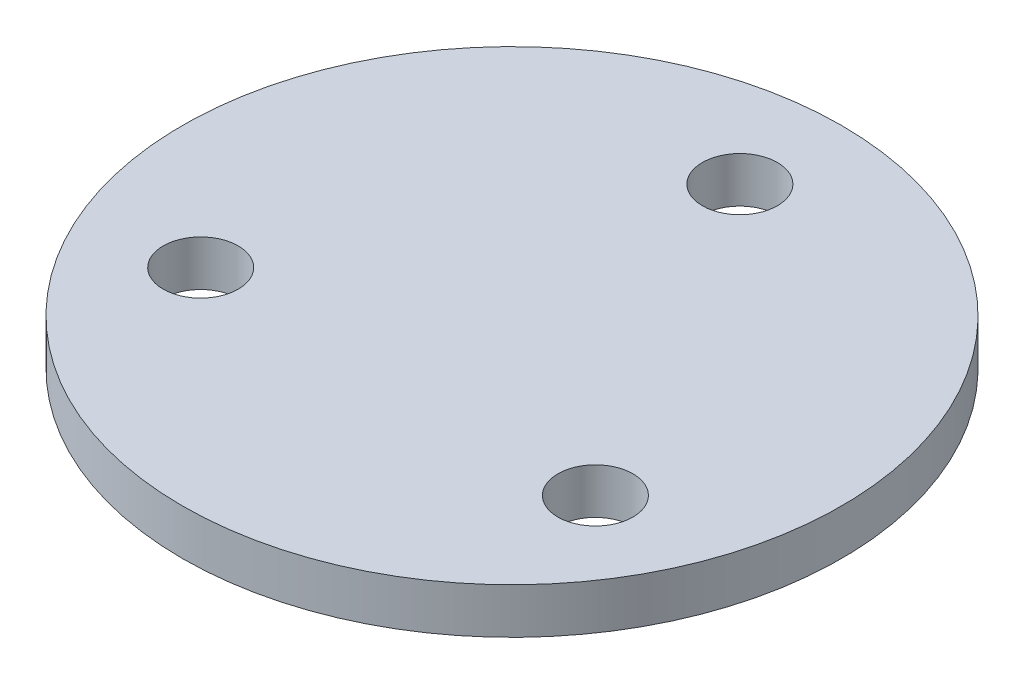
ISO-10303-21;
HEADER;
FILE_DESCRIPTION(('STEP AP214'),'2;1');
FILE_NAME('part.step','',(''),(''),'','','');
FILE_SCHEMA(('AUTOMOTIVE_DESIGN { 1 0 10303 214 1 1 1 1 }'));
ENDSEC;
DATA;
#1=APPLICATION_CONTEXT('core data for automotive mechanical design processes');
#2=APPLICATION_PROTOCOL_DEFINITION('international standard','automotive_design',2000,#1);
#3=PRODUCT_CONTEXT('',#1,'mechanical');
#4=PRODUCT('Part','Part','',(#3));
#5=PRODUCT_RELATED_PRODUCT_CATEGORY('part','',(#4));
#6=PRODUCT_DEFINITION_FORMATION('','',#4);
#7=PRODUCT_DEFINITION_CONTEXT('part definition',#1,'design');
#8=PRODUCT_DEFINITION('design','',#6,#7);
#9=PRODUCT_DEFINITION_SHAPE('','',#8);
#10=(LENGTH_UNIT() NAMED_UNIT(*) SI_UNIT(.MILLI.,.METRE.));
#11=(NAMED_UNIT(*) PLANE_ANGLE_UNIT() SI_UNIT($,.RADIAN.));
#12=(NAMED_UNIT(*) SI_UNIT($,.STERADIAN.) SOLID_ANGLE_UNIT());
#13=UNCERTAINTY_MEASURE_WITH_UNIT(LENGTH_MEASURE(1.E-05),#10,'distance_accuracy_value','');
#14=(GEOMETRIC_REPRESENTATION_CONTEXT(3) GLOBAL_UNCERTAINTY_ASSIGNED_CONTEXT((#13)) GLOBAL_UNIT_ASSIGNED_CONTEXT((#10,
#11,#12)) REPRESENTATION_CONTEXT('',''));
#15=CARTESIAN_POINT('',(0.,0.,0.));
#16=DIRECTION('',(0.,0.,1.));
#17=DIRECTION('',(1.,0.,0.));
#18=AXIS2_PLACEMENT_3D('',#15,#16,#17);
#19=CARTESIAN_POINT('',(0.,1.651,0.));
#20=DIRECTION('',(0.,-1.,0.));
#21=DIRECTION('',(0.,0.,-1.));
#22=AXIS2_PLACEMENT_3D('',#19,#20,#21);
#23=CYLINDRICAL_SURFACE('',#22,11.938);
#24=CARTESIAN_POINT('',(0.,1.651,0.));
#25=DIRECTION('',(0.,1.,0.));
#26=DIRECTION('',(0.,0.,1.));
#27=AXIS2_PLACEMENT_3D('',#24,#25,#26);
#28=CIRCLE('',#27,11.938);
#29=CARTESIAN_POINT('',(0.,1.651,-11.938));
#30=VERTEX_POINT('',#29);
#31=EDGE_CURVE('E10',#30,#30,#28,.T.);
#32=CARTESIAN_POINT('',(0.,0.,0.));
#33=DIRECTION('',(0.,1.,0.));
#34=DIRECTION('',(0.,0.,1.));
#35=AXIS2_PLACEMENT_3D('',#32,#33,#34);
#36=CIRCLE('',#35,11.938);
#37=CARTESIAN_POINT('',(0.,0.,-11.938));
#38=VERTEX_POINT('',#37);
#39=EDGE_CURVE('E36',#38,#38,#36,.T.);
#40=CARTESIAN_POINT('',(0.,1.651,-11.938));
#41=CARTESIAN_POINT('',(0.,1.63380208333333,-11.938));
#42=CARTESIAN_POINT('',(0.,1.61660416666667,-11.938));
#43=CARTESIAN_POINT('',(0.,1.58220833333333,-11.938));
#44=CARTESIAN_POINT('',(0.,1.56501041666667,-11.938));
#45=CARTESIAN_POINT('',(0.,1.53061458333333,-11.938));
#46=CARTESIAN_POINT('',(0.,1.51341666666667,-11.938));
#47=CARTESIAN_POINT('',(0.,1.47902083333333,-11.938));
#48=CARTESIAN_POINT('',(0.,1.46182291666667,-11.938));
#49=CARTESIAN_POINT('',(0.,1.42742708333333,-11.938));
#50=CARTESIAN_POINT('',(0.,1.41022916666667,-11.938));
#51=CARTESIAN_POINT('',(0.,1.37583333333333,-11.938));
#52=CARTESIAN_POINT('',(0.,1.35863541666667,-11.938));
#53=CARTESIAN_POINT('',(0.,1.32423958333333,-11.938));
#54=CARTESIAN_POINT('',(0.,1.30704166666667,-11.938));
#55=CARTESIAN_POINT('',(0.,1.27264583333333,-11.938));
#56=CARTESIAN_POINT('',(0.,1.25544791666667,-11.938));
#57=CARTESIAN_POINT('',(0.,1.22105208333333,-11.938));
#58=CARTESIAN_POINT('',(0.,1.20385416666667,-11.938));
#59=CARTESIAN_POINT('',(0.,1.16945833333333,-11.938));
#60=CARTESIAN_POINT('',(0.,1.15226041666667,-11.938));
#61=CARTESIAN_POINT('',(0.,1.11786458333333,-11.938));
#62=CARTESIAN_POINT('',(0.,1.10066666666667,-11.938));
#63=CARTESIAN_POINT('',(0.,1.06627083333333,-11.938));
#64=CARTESIAN_POINT('',(0.,1.04907291666667,-11.938));
#65=CARTESIAN_POINT('',(0.,1.01467708333333,-11.938));
#66=CARTESIAN_POINT('',(0.,0.997479166666666,-11.938));
#67=CARTESIAN_POINT('',(0.,0.963083333333333,-11.938));
#68=CARTESIAN_POINT('',(0.,0.945885416666666,-11.938));
#69=CARTESIAN_POINT('',(0.,0.911489583333333,-11.938));
#70=CARTESIAN_POINT('',(0.,0.894291666666666,-11.938));
#71=CARTESIAN_POINT('',(0.,0.859895833333333,-11.938));
#72=CARTESIAN_POINT('',(0.,0.842697916666666,-11.938));
#73=CARTESIAN_POINT('',(0.,0.808302083333333,-11.938));
#74=CARTESIAN_POINT('',(0.,0.791104166666666,-11.938));
#75=CARTESIAN_POINT('',(0.,0.756708333333333,-11.938));
#76=CARTESIAN_POINT('',(0.,0.739510416666667,-11.938));
#77=CARTESIAN_POINT('',(0.,0.705114583333333,-11.938));
#78=CARTESIAN_POINT('',(0.,0.687916666666667,-11.938));
#79=CARTESIAN_POINT('',(0.,0.653520833333333,-11.938));
#80=CARTESIAN_POINT('',(0.,0.636322916666667,-11.938));
#81=CARTESIAN_POINT('',(0.,0.601927083333333,-11.938));
#82=CARTESIAN_POINT('',(0.,0.584729166666667,-11.938));
#83=CARTESIAN_POINT('',(0.,0.550333333333333,-11.938));
#84=CARTESIAN_POINT('',(0.,0.533135416666667,-11.938));
#85=CARTESIAN_POINT('',(0.,0.498739583333333,-11.938));
#86=CARTESIAN_POINT('',(0.,0.481541666666667,-11.938));
#87=CARTESIAN_POINT('',(0.,0.447145833333333,-11.938));
#88=CARTESIAN_POINT('',(0.,0.429947916666667,-11.938));
#89=CARTESIAN_POINT('',(0.,0.395552083333333,-11.938));
#90=CARTESIAN_POINT('',(0.,0.378354166666667,-11.938));
#91=CARTESIAN_POINT('',(0.,0.343958333333333,-11.938));
#92=CARTESIAN_POINT('',(0.,0.326760416666667,-11.938));
#93=CARTESIAN_POINT('',(0.,0.292364583333333,-11.938));
#94=CARTESIAN_POINT('',(0.,0.275166666666667,-11.938));
#95=CARTESIAN_POINT('',(0.,0.240770833333333,-11.938));
#96=CARTESIAN_POINT('',(0.,0.223572916666667,-11.938));
#97=CARTESIAN_POINT('',(0.,0.189177083333333,-11.938));
#98=CARTESIAN_POINT('',(0.,0.171979166666667,-11.938));
#99=CARTESIAN_POINT('',(0.,0.137583333333333,-11.938));
#100=CARTESIAN_POINT('',(0.,0.120385416666667,-11.938));
#101=CARTESIAN_POINT('',(0.,0.0859895833333333,-11.938));
#102=CARTESIAN_POINT('',(0.,0.0687916666666667,-11.938));
#103=CARTESIAN_POINT('',(0.,0.0343958333333333,-11.938));
#104=CARTESIAN_POINT('',(0.,0.0171979166666666,-11.938));
#105=CARTESIAN_POINT('',(0.,0.,-11.938));
#106=B_SPLINE_CURVE_WITH_KNOTS('',3,(#40,#41,#42,#43,#44,#45,#46,#47,#48,#49,#50,#51,#52,#53,
#54,#55,#56,#57,#58,#59,#60,#61,#62,#63,#64,#65,#66,#67,#68,#69,#70,#71,#72,#73,#74,#75,#76,#77,
#78,#79,#80,#81,#82,#83,#84,#85,#86,#87,#88,#89,#90,#91,#92,#93,#94,#95,#96,#97,#98,#99,#100,
#101,#102,#103,#104,#105),.UNSPECIFIED.,.F.,.F.,(4,2,2,2,2,2,2,2,2,2,2,2,2,2,2,2,2,2,2,2,2,2,2,
2,2,2,2,2,2,2,2,2,4),(0.,0.0515937500000002,0.1031875,0.15478125,0.206375,0.25796875,0.3095625,
0.36115625,0.41275,0.46434375,0.5159375,0.56753125,0.619125,0.67071875,0.7223125,0.77390625,
0.8255,0.87709375,0.9286875,0.98028125,1.031875,1.08346875,1.1350625,1.18665625,1.23825,
1.28984375,1.3414375,1.39303125,1.444625,1.49621875,1.5478125,1.59940625,1.651),.UNSPECIFIED.);
#107=EDGE_CURVE('BSEAM33',#30,#38,#106,.T.);
#108=ORIENTED_EDGE('',*,*,#31,.F.);
#109=ORIENTED_EDGE('',*,*,#39,.T.);
#110=ORIENTED_EDGE('',*,*,#107,.T.);
#111=ORIENTED_EDGE('',*,*,#107,.F.);
#112=EDGE_LOOP('',(#108,#110,#109,#111));
#113=FACE_BOUND('',#112,.T.);
#114=ADVANCED_FACE('F33',(#113),#23,.T.);
#115=CARTESIAN_POINT('',(0.,1.651,0.));
#116=DIRECTION('',(0.,1.,0.));
#117=DIRECTION('',(0.,0.,1.));
#118=AXIS2_PLACEMENT_3D('',#115,#116,#117);
#119=PLANE('',#118);
#120=CARTESIAN_POINT('',(7.14903970824058,1.651,4.12749999999993));
#121=DIRECTION('',(0.,1.,0.));
#122=DIRECTION('',(-0.866025403784443,0.,-0.499999999999992));
#123=AXIS2_PLACEMENT_3D('',#120,#121,#122);
#124=CIRCLE('',#123,1.3589);
#125=CARTESIAN_POINT('',(7.14903970824058,1.651,5.48639999999993));
#126=VERTEX_POINT('',#125);
#127=EDGE_CURVE('E57',#126,#126,#124,.T.);
#128=ORIENTED_EDGE('',*,*,#127,.F.);
#129=EDGE_LOOP('',(#128));
#130=FACE_BOUND('',#129,.T.);
#131=CARTESIAN_POINT('',(-7.14903970824052,1.651,4.12750000000003));
#132=DIRECTION('',(0.,1.,0.));
#133=DIRECTION('',(0.866025403784436,0.,-0.500000000000004));
#134=AXIS2_PLACEMENT_3D('',#131,#132,#133);
#135=CIRCLE('',#134,1.3589);
#136=CARTESIAN_POINT('',(-7.14903970824052,1.651,5.48640000000003));
#137=VERTEX_POINT('',#136);
#138=EDGE_CURVE('E51',#137,#137,#135,.T.);
#139=ORIENTED_EDGE('',*,*,#138,.F.);
#140=EDGE_LOOP('',(#139));
#141=FACE_BOUND('',#140,.T.);
#142=CARTESIAN_POINT('',(0.,1.651,-8.255));
#143=DIRECTION('',(0.,1.,0.));
#144=DIRECTION('',(0.,0.,1.));
#145=AXIS2_PLACEMENT_3D('',#142,#143,#144);
#146=CIRCLE('',#145,1.3589);
#147=CARTESIAN_POINT('',(0.,1.651,-6.8961));
#148=VERTEX_POINT('',#147);
#149=EDGE_CURVE('E45',#148,#148,#146,.T.);
#150=ORIENTED_EDGE('',*,*,#149,.F.);
#151=EDGE_LOOP('',(#150));
#152=FACE_BOUND('',#151,.T.);
#153=ORIENTED_EDGE('',*,*,#31,.T.);
#154=EDGE_LOOP('',(#153));
#155=FACE_BOUND('',#154,.T.);
#156=ADVANCED_FACE('F73',(#130,#141,#152,#155),#119,.T.);
#157=CARTESIAN_POINT('',(0.,0.,0.));
#158=DIRECTION('',(0.,1.,0.));
#159=DIRECTION('',(0.,0.,1.));
#160=AXIS2_PLACEMENT_3D('',#157,#158,#159);
#161=PLANE('',#160);
#162=CARTESIAN_POINT('',(7.14903970824058,0.,4.12749999999993));
#163=DIRECTION('',(0.,1.,0.));
#164=DIRECTION('',(-0.866025403784443,0.,-0.499999999999992));
#165=AXIS2_PLACEMENT_3D('',#162,#163,#164);
#166=CIRCLE('',#165,1.3589);
#167=CARTESIAN_POINT('',(7.14903970824058,0.,5.48639999999993));
#168=VERTEX_POINT('',#167);
#169=EDGE_CURVE('E54',#168,#168,#166,.T.);
#170=ORIENTED_EDGE('',*,*,#169,.T.);
#171=EDGE_LOOP('',(#170));
#172=FACE_BOUND('',#171,.T.);
#173=CARTESIAN_POINT('',(-7.14903970824052,0.,4.12750000000003));
#174=DIRECTION('',(0.,1.,0.));
#175=DIRECTION('',(0.866025403784436,0.,-0.500000000000004));
#176=AXIS2_PLACEMENT_3D('',#173,#174,#175);
#177=CIRCLE('',#176,1.3589);
#178=CARTESIAN_POINT('',(-7.14903970824052,0.,5.48640000000003));
#179=VERTEX_POINT('',#178);
#180=EDGE_CURVE('E48',#179,#179,#177,.T.);
#181=ORIENTED_EDGE('',*,*,#180,.T.);
#182=EDGE_LOOP('',(#181));
#183=FACE_BOUND('',#182,.T.);
#184=CARTESIAN_POINT('',(0.,0.,-8.255));
#185=DIRECTION('',(0.,1.,0.));
#186=DIRECTION('',(0.,0.,1.));
#187=AXIS2_PLACEMENT_3D('',#184,#185,#186);
#188=CIRCLE('',#187,1.3589);
#189=CARTESIAN_POINT('',(0.,0.,-6.8961));
#190=VERTEX_POINT('',#189);
#191=EDGE_CURVE('E43',#190,#190,#188,.T.);
#192=ORIENTED_EDGE('',*,*,#191,.T.);
#193=EDGE_LOOP('',(#192));
#194=FACE_BOUND('',#193,.T.);
#195=ORIENTED_EDGE('',*,*,#39,.F.);
#196=EDGE_LOOP('',(#195));
#197=FACE_BOUND('',#196,.T.);
#198=ADVANCED_FACE('F63',(#172,#183,#194,#197),#161,.F.);
#199=CARTESIAN_POINT('',(0.,0.,-8.255));
#200=DIRECTION('',(0.,1.,0.));
#201=DIRECTION('',(0.,0.,1.));
#202=AXIS2_PLACEMENT_3D('',#199,#200,#201);
#203=CYLINDRICAL_SURFACE('',#202,1.3589);
#204=CARTESIAN_POINT('',(0.,0.,-6.8961));
#205=CARTESIAN_POINT('',(0.,0.0171979166666667,-6.8961));
#206=CARTESIAN_POINT('',(0.,0.0343958333333333,-6.8961));
#207=CARTESIAN_POINT('',(0.,0.0687916666666667,-6.8961));
#208=CARTESIAN_POINT('',(0.,0.0859895833333333,-6.8961));
#209=CARTESIAN_POINT('',(0.,0.120385416666667,-6.8961));
#210=CARTESIAN_POINT('',(0.,0.137583333333333,-6.8961));
#211=CARTESIAN_POINT('',(0.,0.171979166666667,-6.8961));
#212=CARTESIAN_POINT('',(0.,0.189177083333333,-6.8961));
#213=CARTESIAN_POINT('',(0.,0.223572916666667,-6.8961));
#214=CARTESIAN_POINT('',(0.,0.240770833333333,-6.8961));
#215=CARTESIAN_POINT('',(0.,0.275166666666667,-6.8961));
#216=CARTESIAN_POINT('',(0.,0.292364583333333,-6.8961));
#217=CARTESIAN_POINT('',(0.,0.326760416666667,-6.8961));
#218=CARTESIAN_POINT('',(0.,0.343958333333333,-6.8961));
#219=CARTESIAN_POINT('',(0.,0.378354166666667,-6.8961));
#220=CARTESIAN_POINT('',(0.,0.395552083333333,-6.8961));
#221=CARTESIAN_POINT('',(0.,0.429947916666667,-6.8961));
#222=CARTESIAN_POINT('',(0.,0.447145833333333,-6.8961));
#223=CARTESIAN_POINT('',(0.,0.481541666666667,-6.8961));
#224=CARTESIAN_POINT('',(0.,0.498739583333333,-6.8961));
#225=CARTESIAN_POINT('',(0.,0.533135416666667,-6.8961));
#226=CARTESIAN_POINT('',(0.,0.550333333333333,-6.8961));
#227=CARTESIAN_POINT('',(0.,0.584729166666667,-6.8961));
#228=CARTESIAN_POINT('',(0.,0.601927083333333,-6.8961));
#229=CARTESIAN_POINT('',(0.,0.636322916666667,-6.8961));
#230=CARTESIAN_POINT('',(0.,0.653520833333333,-6.8961));
#231=CARTESIAN_POINT('',(0.,0.687916666666667,-6.8961));
#232=CARTESIAN_POINT('',(0.,0.705114583333333,-6.8961));
#233=CARTESIAN_POINT('',(0.,0.739510416666667,-6.8961));
#234=CARTESIAN_POINT('',(0.,0.756708333333333,-6.8961));
#235=CARTESIAN_POINT('',(0.,0.791104166666667,-6.8961));
#236=CARTESIAN_POINT('',(0.,0.808302083333333,-6.8961));
#237=CARTESIAN_POINT('',(0.,0.842697916666667,-6.8961));
#238=CARTESIAN_POINT('',(0.,0.859895833333333,-6.8961));
#239=CARTESIAN_POINT('',(0.,0.894291666666667,-6.8961));
#240=CARTESIAN_POINT('',(0.,0.911489583333333,-6.8961));
#241=CARTESIAN_POINT('',(0.,0.945885416666667,-6.8961));
#242=CARTESIAN_POINT('',(0.,0.963083333333333,-6.8961));
#243=CARTESIAN_POINT('',(0.,0.997479166666666,-6.8961));
#244=CARTESIAN_POINT('',(0.,1.01467708333333,-6.8961));
#245=CARTESIAN_POINT('',(0.,1.04907291666667,-6.8961));
#246=CARTESIAN_POINT('',(0.,1.06627083333333,-6.8961));
#247=CARTESIAN_POINT('',(0.,1.10066666666667,-6.8961));
#248=CARTESIAN_POINT('',(0.,1.11786458333333,-6.8961));
#249=CARTESIAN_POINT('',(0.,1.15226041666667,-6.8961));
#250=CARTESIAN_POINT('',(0.,1.16945833333333,-6.8961));
#251=CARTESIAN_POINT('',(0.,1.20385416666667,-6.8961));
#252=CARTESIAN_POINT('',(0.,1.22105208333333,-6.8961));
#253=CARTESIAN_POINT('',(0.,1.25544791666667,-6.8961));
#254=CARTESIAN_POINT('',(0.,1.27264583333333,-6.8961));
#255=CARTESIAN_POINT('',(0.,1.30704166666667,-6.8961));
#256=CARTESIAN_POINT('',(0.,1.32423958333333,-6.8961));
#257=CARTESIAN_POINT('',(0.,1.35863541666667,-6.8961));
#258=CARTESIAN_POINT('',(0.,1.37583333333333,-6.8961));
#259=CARTESIAN_POINT('',(0.,1.41022916666667,-6.8961));
#260=CARTESIAN_POINT('',(0.,1.42742708333333,-6.8961));
#261=CARTESIAN_POINT('',(0.,1.46182291666667,-6.8961));
#262=CARTESIAN_POINT('',(0.,1.47902083333333,-6.8961));
#263=CARTESIAN_POINT('',(0.,1.51341666666667,-6.8961));
#264=CARTESIAN_POINT('',(0.,1.53061458333333,-6.8961));
#265=CARTESIAN_POINT('',(0.,1.56501041666667,-6.8961));
#266=CARTESIAN_POINT('',(0.,1.58220833333333,-6.8961));
#267=CARTESIAN_POINT('',(0.,1.61660416666667,-6.8961));
#268=CARTESIAN_POINT('',(0.,1.63380208333333,-6.8961));
#269=CARTESIAN_POINT('',(0.,1.651,-6.8961));
#270=B_SPLINE_CURVE_WITH_KNOTS('',3,(#204,#205,#206,#207,#208,#209,#210,#211,#212,#213,#214,
#215,#216,#217,#218,#219,#220,#221,#222,#223,#224,#225,#226,#227,#228,#229,#230,#231,#232,#233,
#234,#235,#236,#237,#238,#239,#240,#241,#242,#243,#244,#245,#246,#247,#248,#249,#250,#251,#252,
#253,#254,#255,#256,#257,#258,#259,#260,#261,#262,#263,#264,#265,#266,#267,#268,#269),
.UNSPECIFIED.,.F.,.F.,(4,2,2,2,2,2,2,2,2,2,2,2,2,2,2,2,2,2,2,2,2,2,2,2,2,2,2,2,2,2,2,2,4),(0.,
0.05159375,0.1031875,0.15478125,0.206375,0.25796875,0.3095625,0.36115625,0.41275,0.46434375,
0.5159375,0.56753125,0.619125,0.67071875,0.7223125,0.77390625,0.8255,0.87709375,0.9286875,
0.98028125,1.031875,1.08346875,1.1350625,1.18665625,1.23825,1.28984375,1.3414375,1.39303125,
1.444625,1.49621875,1.5478125,1.59940625,1.651),.UNSPECIFIED.);
#271=EDGE_CURVE('BSEAM81',#190,#148,#270,.T.);
#272=ORIENTED_EDGE('',*,*,#191,.F.);
#273=ORIENTED_EDGE('',*,*,#149,.T.);
#274=ORIENTED_EDGE('',*,*,#271,.T.);
#275=ORIENTED_EDGE('',*,*,#271,.F.);
#276=EDGE_LOOP('',(#272,#274,#273,#275));
#277=FACE_BOUND('',#276,.T.);
#278=ADVANCED_FACE('F81',(#277),#203,.F.);
#279=CARTESIAN_POINT('',(-7.14903970824052,0.,4.12750000000003));
#280=DIRECTION('',(0.,1.,0.));
#281=DIRECTION('',(0.,0.,1.));
#282=AXIS2_PLACEMENT_3D('',#279,#280,#281);
#283=CYLINDRICAL_SURFACE('',#282,1.3589);
#284=CARTESIAN_POINT('',(-7.14903970824052,0.,5.48640000000003));
#285=CARTESIAN_POINT('',(-7.14903970824052,0.0171979166666667,5.48640000000003));
#286=CARTESIAN_POINT('',(-7.14903970824052,0.0343958333333333,5.48640000000003));
#287=CARTESIAN_POINT('',(-7.14903970824052,0.0687916666666667,5.48640000000003));
#288=CARTESIAN_POINT('',(-7.14903970824052,0.0859895833333333,5.48640000000003));
#289=CARTESIAN_POINT('',(-7.14903970824052,0.120385416666667,5.48640000000003));
#290=CARTESIAN_POINT('',(-7.14903970824052,0.137583333333333,5.48640000000003));
#291=CARTESIAN_POINT('',(-7.14903970824052,0.171979166666667,5.48640000000003));
#292=CARTESIAN_POINT('',(-7.14903970824052,0.189177083333333,5.48640000000003));
#293=CARTESIAN_POINT('',(-7.14903970824052,0.223572916666667,5.48640000000003));
#294=CARTESIAN_POINT('',(-7.14903970824052,0.240770833333333,5.48640000000003));
#295=CARTESIAN_POINT('',(-7.14903970824052,0.275166666666667,5.48640000000003));
#296=CARTESIAN_POINT('',(-7.14903970824052,0.292364583333333,5.48640000000003));
#297=CARTESIAN_POINT('',(-7.14903970824052,0.326760416666667,5.48640000000003));
#298=CARTESIAN_POINT('',(-7.14903970824052,0.343958333333333,5.48640000000003));
#299=CARTESIAN_POINT('',(-7.14903970824052,0.378354166666667,5.48640000000003));
#300=CARTESIAN_POINT('',(-7.14903970824052,0.395552083333333,5.48640000000003));
#301=CARTESIAN_POINT('',(-7.14903970824052,0.429947916666667,5.48640000000003));
#302=CARTESIAN_POINT('',(-7.14903970824052,0.447145833333333,5.48640000000003));
#303=CARTESIAN_POINT('',(-7.14903970824052,0.481541666666667,5.48640000000003));
#304=CARTESIAN_POINT('',(-7.14903970824052,0.498739583333333,5.48640000000003));
#305=CARTESIAN_POINT('',(-7.14903970824052,0.533135416666667,5.48640000000003));
#306=CARTESIAN_POINT('',(-7.14903970824052,0.550333333333333,5.48640000000003));
#307=CARTESIAN_POINT('',(-7.14903970824052,0.584729166666667,5.48640000000003));
#308=CARTESIAN_POINT('',(-7.14903970824052,0.601927083333333,5.48640000000003));
#309=CARTESIAN_POINT('',(-7.14903970824052,0.636322916666667,5.48640000000003));
#310=CARTESIAN_POINT('',(-7.14903970824052,0.653520833333333,5.48640000000003));
#311=CARTESIAN_POINT('',(-7.14903970824052,0.687916666666667,5.48640000000003));
#312=CARTESIAN_POINT('',(-7.14903970824052,0.705114583333333,5.48640000000003));
#313=CARTESIAN_POINT('',(-7.14903970824052,0.739510416666667,5.48640000000003));
#314=CARTESIAN_POINT('',(-7.14903970824052,0.756708333333333,5.48640000000003));
#315=CARTESIAN_POINT('',(-7.14903970824052,0.791104166666667,5.48640000000003));
#316=CARTESIAN_POINT('',(-7.14903970824052,0.808302083333333,5.48640000000003));
#317=CARTESIAN_POINT('',(-7.14903970824052,0.842697916666667,5.48640000000003));
#318=CARTESIAN_POINT('',(-7.14903970824052,0.859895833333333,5.48640000000003));
#319=CARTESIAN_POINT('',(-7.14903970824052,0.894291666666667,5.48640000000003));
#320=CARTESIAN_POINT('',(-7.14903970824052,0.911489583333333,5.48640000000003));
#321=CARTESIAN_POINT('',(-7.14903970824052,0.945885416666667,5.48640000000003));
#322=CARTESIAN_POINT('',(-7.14903970824052,0.963083333333333,5.48640000000003));
#323=CARTESIAN_POINT('',(-7.14903970824052,0.997479166666666,5.48640000000003));
#324=CARTESIAN_POINT('',(-7.14903970824052,1.01467708333333,5.48640000000003));
#325=CARTESIAN_POINT('',(-7.14903970824052,1.04907291666667,5.48640000000003));
#326=CARTESIAN_POINT('',(-7.14903970824052,1.06627083333333,5.48640000000003));
#327=CARTESIAN_POINT('',(-7.14903970824052,1.10066666666667,5.48640000000003));
#328=CARTESIAN_POINT('',(-7.14903970824052,1.11786458333333,5.48640000000003));
#329=CARTESIAN_POINT('',(-7.14903970824052,1.15226041666667,5.48640000000003));
#330=CARTESIAN_POINT('',(-7.14903970824052,1.16945833333333,5.48640000000003));
#331=CARTESIAN_POINT('',(-7.14903970824052,1.20385416666667,5.48640000000003));
#332=CARTESIAN_POINT('',(-7.14903970824052,1.22105208333333,5.48640000000003));
#333=CARTESIAN_POINT('',(-7.14903970824052,1.25544791666667,5.48640000000003));
#334=CARTESIAN_POINT('',(-7.14903970824052,1.27264583333333,5.48640000000003));
#335=CARTESIAN_POINT('',(-7.14903970824052,1.30704166666667,5.48640000000003));
#336=CARTESIAN_POINT('',(-7.14903970824052,1.32423958333333,5.48640000000003));
#337=CARTESIAN_POINT('',(-7.14903970824052,1.35863541666667,5.48640000000003));
#338=CARTESIAN_POINT('',(-7.14903970824052,1.37583333333333,5.48640000000003));
#339=CARTESIAN_POINT('',(-7.14903970824052,1.41022916666667,5.48640000000003));
#340=CARTESIAN_POINT('',(-7.14903970824052,1.42742708333333,5.48640000000003));
#341=CARTESIAN_POINT('',(-7.14903970824052,1.46182291666667,5.48640000000003));
#342=CARTESIAN_POINT('',(-7.14903970824052,1.47902083333333,5.48640000000003));
#343=CARTESIAN_POINT('',(-7.14903970824052,1.51341666666667,5.48640000000003));
#344=CARTESIAN_POINT('',(-7.14903970824052,1.53061458333333,5.48640000000003));
#345=CARTESIAN_POINT('',(-7.14903970824052,1.56501041666667,5.48640000000003));
#346=CARTESIAN_POINT('',(-7.14903970824052,1.58220833333333,5.48640000000003));
#347=CARTESIAN_POINT('',(-7.14903970824052,1.61660416666667,5.48640000000003));
#348=CARTESIAN_POINT('',(-7.14903970824052,1.63380208333333,5.48640000000003));
#349=CARTESIAN_POINT('',(-7.14903970824052,1.651,5.48640000000003));
#350=B_SPLINE_CURVE_WITH_KNOTS('',3,(#284,#285,#286,#287,#288,#289,#290,#291,#292,#293,#294,
#295,#296,#297,#298,#299,#300,#301,#302,#303,#304,#305,#306,#307,#308,#309,#310,#311,#312,#313,
#314,#315,#316,#317,#318,#319,#320,#321,#322,#323,#324,#325,#326,#327,#328,#329,#330,#331,#332,
#333,#334,#335,#336,#337,#338,#339,#340,#341,#342,#343,#344,#345,#346,#347,#348,#349),
.UNSPECIFIED.,.F.,.F.,(4,2,2,2,2,2,2,2,2,2,2,2,2,2,2,2,2,2,2,2,2,2,2,2,2,2,2,2,2,2,2,2,4),(0.,
0.05159375,0.1031875,0.15478125,0.206375,0.25796875,0.3095625,0.36115625,0.41275,0.46434375,
0.5159375,0.56753125,0.619125,0.67071875,0.7223125,0.77390625,0.8255,0.87709375,0.9286875,
0.98028125,1.031875,1.08346875,1.1350625,1.18665625,1.23825,1.28984375,1.3414375,1.39303125,
1.444625,1.49621875,1.5478125,1.59940625,1.651),.UNSPECIFIED.);
#351=EDGE_CURVE('BSEAM69',#179,#137,#350,.T.);
#352=ORIENTED_EDGE('',*,*,#180,.F.);
#353=ORIENTED_EDGE('',*,*,#138,.T.);
#354=ORIENTED_EDGE('',*,*,#351,.T.);
#355=ORIENTED_EDGE('',*,*,#351,.F.);
#356=EDGE_LOOP('',(#352,#354,#353,#355));
#357=FACE_BOUND('',#356,.T.);
#358=ADVANCED_FACE('F69',(#357),#283,.F.);
#359=CARTESIAN_POINT('',(7.14903970824058,0.,4.12749999999993));
#360=DIRECTION('',(0.,1.,0.));
#361=DIRECTION('',(0.,0.,1.));
#362=AXIS2_PLACEMENT_3D('',#359,#360,#361);
#363=CYLINDRICAL_SURFACE('',#362,1.3589);
#364=CARTESIAN_POINT('',(7.14903970824058,0.,5.48639999999993));
#365=CARTESIAN_POINT('',(7.14903970824058,0.0171979166666667,5.48639999999993));
#366=CARTESIAN_POINT('',(7.14903970824058,0.0343958333333333,5.48639999999993));
#367=CARTESIAN_POINT('',(7.14903970824058,0.0687916666666667,5.48639999999993));
#368=CARTESIAN_POINT('',(7.14903970824058,0.0859895833333333,5.48639999999993));
#369=CARTESIAN_POINT('',(7.14903970824058,0.120385416666667,5.48639999999993));
#370=CARTESIAN_POINT('',(7.14903970824058,0.137583333333333,5.48639999999993));
#371=CARTESIAN_POINT('',(7.14903970824058,0.171979166666667,5.48639999999993));
#372=CARTESIAN_POINT('',(7.14903970824058,0.189177083333333,5.48639999999993));
#373=CARTESIAN_POINT('',(7.14903970824058,0.223572916666667,5.48639999999993));
#374=CARTESIAN_POINT('',(7.14903970824058,0.240770833333333,5.48639999999993));
#375=CARTESIAN_POINT('',(7.14903970824058,0.275166666666667,5.48639999999993));
#376=CARTESIAN_POINT('',(7.14903970824058,0.292364583333333,5.48639999999993));
#377=CARTESIAN_POINT('',(7.14903970824058,0.326760416666667,5.48639999999993));
#378=CARTESIAN_POINT('',(7.14903970824058,0.343958333333333,5.48639999999993));
#379=CARTESIAN_POINT('',(7.14903970824058,0.378354166666667,5.48639999999993));
#380=CARTESIAN_POINT('',(7.14903970824058,0.395552083333333,5.48639999999993));
#381=CARTESIAN_POINT('',(7.14903970824058,0.429947916666667,5.48639999999993));
#382=CARTESIAN_POINT('',(7.14903970824058,0.447145833333333,5.48639999999993));
#383=CARTESIAN_POINT('',(7.14903970824058,0.481541666666667,5.48639999999993));
#384=CARTESIAN_POINT('',(7.14903970824058,0.498739583333333,5.48639999999993));
#385=CARTESIAN_POINT('',(7.14903970824058,0.533135416666667,5.48639999999993));
#386=CARTESIAN_POINT('',(7.14903970824058,0.550333333333333,5.48639999999993));
#387=CARTESIAN_POINT('',(7.14903970824058,0.584729166666667,5.48639999999993));
#388=CARTESIAN_POINT('',(7.14903970824058,0.601927083333333,5.48639999999993));
#389=CARTESIAN_POINT('',(7.14903970824058,0.636322916666667,5.48639999999993));
#390=CARTESIAN_POINT('',(7.14903970824058,0.653520833333333,5.48639999999993));
#391=CARTESIAN_POINT('',(7.14903970824058,0.687916666666667,5.48639999999993));
#392=CARTESIAN_POINT('',(7.14903970824058,0.705114583333333,5.48639999999993));
#393=CARTESIAN_POINT('',(7.14903970824058,0.739510416666667,5.48639999999993));
#394=CARTESIAN_POINT('',(7.14903970824058,0.756708333333333,5.48639999999993));
#395=CARTESIAN_POINT('',(7.14903970824058,0.791104166666667,5.48639999999993));
#396=CARTESIAN_POINT('',(7.14903970824058,0.808302083333333,5.48639999999993));
#397=CARTESIAN_POINT('',(7.14903970824058,0.842697916666667,5.48639999999993));
#398=CARTESIAN_POINT('',(7.14903970824058,0.859895833333333,5.48639999999993));
#399=CARTESIAN_POINT('',(7.14903970824058,0.894291666666667,5.48639999999993));
#400=CARTESIAN_POINT('',(7.14903970824058,0.911489583333333,5.48639999999993));
#401=CARTESIAN_POINT('',(7.14903970824058,0.945885416666667,5.48639999999993));
#402=CARTESIAN_POINT('',(7.14903970824058,0.963083333333333,5.48639999999993));
#403=CARTESIAN_POINT('',(7.14903970824058,0.997479166666666,5.48639999999993));
#404=CARTESIAN_POINT('',(7.14903970824058,1.01467708333333,5.48639999999993));
#405=CARTESIAN_POINT('',(7.14903970824058,1.04907291666667,5.48639999999993));
#406=CARTESIAN_POINT('',(7.14903970824058,1.06627083333333,5.48639999999993));
#407=CARTESIAN_POINT('',(7.14903970824058,1.10066666666667,5.48639999999993));
#408=CARTESIAN_POINT('',(7.14903970824058,1.11786458333333,5.48639999999993));
#409=CARTESIAN_POINT('',(7.14903970824058,1.15226041666667,5.48639999999993));
#410=CARTESIAN_POINT('',(7.14903970824058,1.16945833333333,5.48639999999993));
#411=CARTESIAN_POINT('',(7.14903970824058,1.20385416666667,5.48639999999993));
#412=CARTESIAN_POINT('',(7.14903970824058,1.22105208333333,5.48639999999993));
#413=CARTESIAN_POINT('',(7.14903970824058,1.25544791666667,5.48639999999993));
#414=CARTESIAN_POINT('',(7.14903970824058,1.27264583333333,5.48639999999993));
#415=CARTESIAN_POINT('',(7.14903970824058,1.30704166666667,5.48639999999993));
#416=CARTESIAN_POINT('',(7.14903970824058,1.32423958333333,5.48639999999993));
#417=CARTESIAN_POINT('',(7.14903970824058,1.35863541666667,5.48639999999993));
#418=CARTESIAN_POINT('',(7.14903970824058,1.37583333333333,5.48639999999993));
#419=CARTESIAN_POINT('',(7.14903970824058,1.41022916666667,5.48639999999993));
#420=CARTESIAN_POINT('',(7.14903970824058,1.42742708333333,5.48639999999993));
#421=CARTESIAN_POINT('',(7.14903970824058,1.46182291666667,5.48639999999993));
#422=CARTESIAN_POINT('',(7.14903970824058,1.47902083333333,5.48639999999993));
#423=CARTESIAN_POINT('',(7.14903970824058,1.51341666666667,5.48639999999993));
#424=CARTESIAN_POINT('',(7.14903970824058,1.53061458333333,5.48639999999993));
#425=CARTESIAN_POINT('',(7.14903970824058,1.56501041666667,5.48639999999993));
#426=CARTESIAN_POINT('',(7.14903970824058,1.58220833333333,5.48639999999993));
#427=CARTESIAN_POINT('',(7.14903970824058,1.61660416666667,5.48639999999993));
#428=CARTESIAN_POINT('',(7.14903970824058,1.63380208333333,5.48639999999993));
#429=CARTESIAN_POINT('',(7.14903970824058,1.651,5.48639999999993));
#430=B_SPLINE_CURVE_WITH_KNOTS('',3,(#364,#365,#366,#367,#368,#369,#370,#371,#372,#373,#374,
#375,#376,#377,#378,#379,#380,#381,#382,#383,#384,#385,#386,#387,#388,#389,#390,#391,#392,#393,
#394,#395,#396,#397,#398,#399,#400,#401,#402,#403,#404,#405,#406,#407,#408,#409,#410,#411,#412,
#413,#414,#415,#416,#417,#418,#419,#420,#421,#422,#423,#424,#425,#426,#427,#428,#429),
.UNSPECIFIED.,.F.,.F.,(4,2,2,2,2,2,2,2,2,2,2,2,2,2,2,2,2,2,2,2,2,2,2,2,2,2,2,2,2,2,2,2,4),(0.,
0.05159375,0.1031875,0.15478125,0.206375,0.25796875,0.3095625,0.36115625,0.41275,0.46434375,
0.5159375,0.56753125,0.619125,0.67071875,0.7223125,0.77390625,0.8255,0.87709375,0.9286875,
0.98028125,1.031875,1.08346875,1.1350625,1.18665625,1.23825,1.28984375,1.3414375,1.39303125,
1.444625,1.49621875,1.5478125,1.59940625,1.651),.UNSPECIFIED.);
#431=EDGE_CURVE('BSEAM66',#168,#126,#430,.T.);
#432=ORIENTED_EDGE('',*,*,#169,.F.);
#433=ORIENTED_EDGE('',*,*,#127,.T.);
#434=ORIENTED_EDGE('',*,*,#431,.T.);
#435=ORIENTED_EDGE('',*,*,#431,.F.);
#436=EDGE_LOOP('',(#432,#434,#433,#435));
#437=FACE_BOUND('',#436,.T.);
#438=ADVANCED_FACE('F66',(#437),#363,.F.);
#439=CLOSED_SHELL('',(#114,#156,#198,#278,#358,#438));
#440=MANIFOLD_SOLID_BREP('B2',#439);
#441=ADVANCED_BREP_SHAPE_REPRESENTATION('',(#18,#440),#14);
#442=SHAPE_DEFINITION_REPRESENTATION(#9,#441);
ENDSEC;
END-ISO-10303-21;
